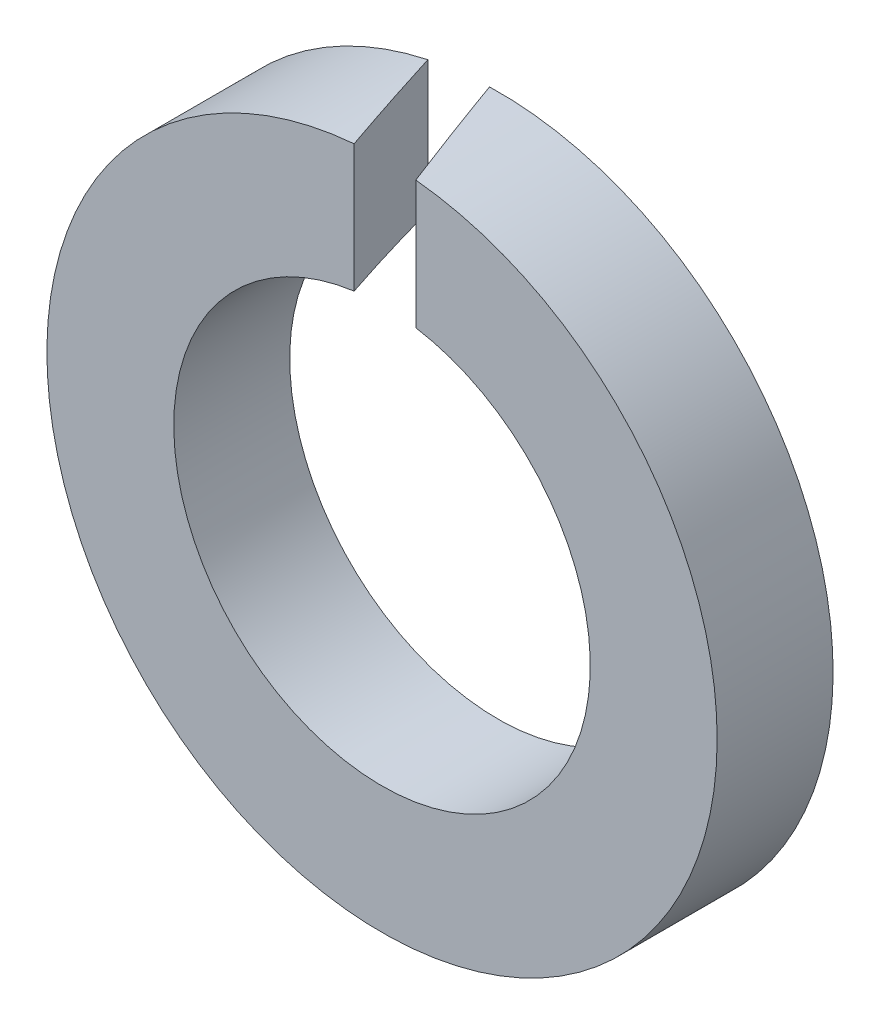
ISO-10303-21;
HEADER;
FILE_DESCRIPTION(('STEP AP214'),'2;1');
FILE_NAME('part.step','',(''),(''),'','','');
FILE_SCHEMA(('AUTOMOTIVE_DESIGN { 1 0 10303 214 1 1 1 1 }'));
ENDSEC;
DATA;
#1=APPLICATION_CONTEXT('core data for automotive mechanical design processes');
#2=APPLICATION_PROTOCOL_DEFINITION('international standard','automotive_design',2000,#1);
#3=PRODUCT_CONTEXT('',#1,'mechanical');
#4=PRODUCT('Part','Part','',(#3));
#5=PRODUCT_RELATED_PRODUCT_CATEGORY('part','',(#4));
#6=PRODUCT_DEFINITION_FORMATION('','',#4);
#7=PRODUCT_DEFINITION_CONTEXT('part definition',#1,'design');
#8=PRODUCT_DEFINITION('design','',#6,#7);
#9=PRODUCT_DEFINITION_SHAPE('','',#8);
#10=(LENGTH_UNIT() NAMED_UNIT(*) SI_UNIT(.MILLI.,.METRE.));
#11=(NAMED_UNIT(*) PLANE_ANGLE_UNIT() SI_UNIT($,.RADIAN.));
#12=(NAMED_UNIT(*) SI_UNIT($,.STERADIAN.) SOLID_ANGLE_UNIT());
#13=UNCERTAINTY_MEASURE_WITH_UNIT(LENGTH_MEASURE(1.E-05),#10,'distance_accuracy_value','');
#14=(GEOMETRIC_REPRESENTATION_CONTEXT(3) GLOBAL_UNCERTAINTY_ASSIGNED_CONTEXT((#13)) GLOBAL_UNIT_ASSIGNED_CONTEXT((#10,
#11,#12)) REPRESENTATION_CONTEXT('',''));
#15=CARTESIAN_POINT('',(0.,0.,0.));
#16=DIRECTION('',(0.,0.,1.));
#17=DIRECTION('',(1.,0.,0.));
#18=AXIS2_PLACEMENT_3D('',#15,#16,#17);
#19=CARTESIAN_POINT('',(0.,0.,-5.3));
#20=DIRECTION('',(0.,0.,1.));
#21=DIRECTION('',(1.,0.,0.));
#22=AXIS2_PLACEMENT_3D('',#19,#20,#21);
#23=CYLINDRICAL_SURFACE('',#22,15.32);
#24=CARTESIAN_POINT('',(0.,0.,-5.3));
#25=DIRECTION('',(0.,0.,1.));
#26=DIRECTION('',(1.,0.,0.));
#27=AXIS2_PLACEMENT_3D('',#24,#25,#26);
#28=CIRCLE('',#27,15.32);
#29=CARTESIAN_POINT('',(-3.20605556858195,14.9807746025085,-5.3));
#30=VERTEX_POINT('',#29);
#31=CARTESIAN_POINT('',(-0.385984471520785,15.3151368256292,-5.3));
#32=VERTEX_POINT('',#31);
#33=EDGE_CURVE('E97',#30,#32,#28,.T.);
#34=ORIENTED_EDGE('',*,*,#33,.T.);
#35=CARTESIAN_POINT('',(0.,0.,-4.23951638023651));
#36=DIRECTION('',(-0.939692620785909,0.,0.342020143325666));
#37=DIRECTION('',(0.342020143325666,0.,0.93969262078591));
#38=AXIS2_PLACEMENT_3D('',#35,#36,#37);
#39=ELLIPSE('',#38,44.7926834104988,15.32);
#40=CARTESIAN_POINT('',(1.54305777009007,15.2420921371761,0.));
#41=VERTEX_POINT('',#40);
#42=EDGE_CURVE('E84',#32,#41,#39,.F.);
#43=ORIENTED_EDGE('',*,*,#42,.T.);
#44=CARTESIAN_POINT('',(0.,0.,0.));
#45=DIRECTION('',(0.,0.,1.));
#46=DIRECTION('',(1.,0.,0.));
#47=AXIS2_PLACEMENT_3D('',#44,#45,#46);
#48=CIRCLE('',#47,15.32);
#49=CARTESIAN_POINT('',(-1.27701332697109,15.2666838888718,0.));
#50=VERTEX_POINT('',#49);
#51=EDGE_CURVE('E92',#50,#41,#48,.T.);
#52=ORIENTED_EDGE('',*,*,#51,.F.);
#53=CARTESIAN_POINT('',(0.,0.,3.50856528019573));
#54=DIRECTION('',(0.939692620785909,0.,-0.342020143325666));
#55=DIRECTION('',(0.342020143325666,0.,0.939692620785909));
#56=AXIS2_PLACEMENT_3D('',#53,#54,#55);
#57=ELLIPSE('',#56,44.7926834104988,15.32);
#58=EDGE_CURVE('E76',#50,#30,#57,.F.);
#59=ORIENTED_EDGE('',*,*,#58,.T.);
#60=EDGE_LOOP('',(#34,#43,#52,#59));
#61=FACE_BOUND('',#60,.T.);
#62=ADVANCED_FACE('F39',(#61),#23,.T.);
#63=CARTESIAN_POINT('',(0.,0.,-5.3));
#64=DIRECTION('',(0.,0.,1.));
#65=DIRECTION('',(1.,0.,0.));
#66=AXIS2_PLACEMENT_3D('',#63,#64,#65);
#67=PLANE('',#66);
#68=DIRECTION('',(0.,-1.,0.));
#69=VECTOR('',#68,1.);
#70=CARTESIAN_POINT('',(-0.385984471520785,15.32,-5.3));
#71=LINE('',#70,#69);
#72=CARTESIAN_POINT('',(-0.385984471520785,9.51217199107253,-5.3));
#73=VERTEX_POINT('',#72);
#74=EDGE_CURVE('E60',#32,#73,#71,.T.);
#75=ORIENTED_EDGE('',*,*,#74,.F.);
#76=ORIENTED_EDGE('',*,*,#33,.F.);
#77=DIRECTION('',(0.,-1.,0.));
#78=VECTOR('',#77,1.);
#79=CARTESIAN_POINT('',(-3.20605556858195,15.32,-5.3));
#80=LINE('',#79,#78);
#81=CARTESIAN_POINT('',(-3.20605556858195,8.96390582788355,-5.3));
#82=VERTEX_POINT('',#81);
#83=EDGE_CURVE('E79',#30,#82,#80,.T.);
#84=ORIENTED_EDGE('',*,*,#83,.T.);
#85=CARTESIAN_POINT('',(0.,0.,-5.3));
#86=DIRECTION('',(0.,0.,1.));
#87=DIRECTION('',(1.,0.,0.));
#88=AXIS2_PLACEMENT_3D('',#85,#86,#87);
#89=CIRCLE('',#88,9.52);
#90=EDGE_CURVE('E98',#82,#73,#89,.T.);
#91=ORIENTED_EDGE('',*,*,#90,.T.);
#92=EDGE_LOOP('',(#75,#76,#84,#91));
#93=FACE_BOUND('',#92,.T.);
#94=ADVANCED_FACE('F107',(#93),#67,.F.);
#95=CARTESIAN_POINT('',(0.,0.,0.));
#96=DIRECTION('',(0.,0.,1.));
#97=DIRECTION('',(1.,0.,0.));
#98=AXIS2_PLACEMENT_3D('',#95,#96,#97);
#99=PLANE('',#98);
#100=ORIENTED_EDGE('',*,*,#51,.T.);
#101=DIRECTION('',(0.,-1.,0.));
#102=VECTOR('',#101,1.);
#103=CARTESIAN_POINT('',(1.54305777009007,15.32,0.));
#104=LINE('',#103,#102);
#105=CARTESIAN_POINT('',(1.54305777009007,9.39411372712535,0.));
#106=VERTEX_POINT('',#105);
#107=EDGE_CURVE('E85',#41,#106,#104,.T.);
#108=ORIENTED_EDGE('',*,*,#107,.T.);
#109=CARTESIAN_POINT('',(0.,0.,0.));
#110=DIRECTION('',(0.,0.,1.));
#111=DIRECTION('',(1.,0.,0.));
#112=AXIS2_PLACEMENT_3D('',#109,#110,#111);
#113=CIRCLE('',#112,9.52);
#114=CARTESIAN_POINT('',(-1.27701332697109,9.43396189110059,0.));
#115=VERTEX_POINT('',#114);
#116=EDGE_CURVE('E94',#115,#106,#113,.T.);
#117=ORIENTED_EDGE('',*,*,#116,.F.);
#118=DIRECTION('',(0.,-1.,0.));
#119=VECTOR('',#118,1.);
#120=CARTESIAN_POINT('',(-1.27701332697109,15.32,0.));
#121=LINE('',#120,#119);
#122=EDGE_CURVE('E53',#50,#115,#121,.T.);
#123=ORIENTED_EDGE('',*,*,#122,.F.);
#124=EDGE_LOOP('',(#100,#108,#117,#123));
#125=FACE_BOUND('',#124,.T.);
#126=ADVANCED_FACE('F90',(#125),#99,.T.);
#127=CARTESIAN_POINT('',(0.,0.,-5.3));
#128=DIRECTION('',(0.,0.,1.));
#129=DIRECTION('',(1.,0.,0.));
#130=AXIS2_PLACEMENT_3D('',#127,#128,#129);
#131=CYLINDRICAL_SURFACE('',#130,9.52);
#132=CARTESIAN_POINT('',(0.,0.,-4.23951638023651));
#133=DIRECTION('',(-0.939692620785909,0.,0.342020143325666));
#134=DIRECTION('',(0.342020143325666,0.,0.93969262078591));
#135=AXIS2_PLACEMENT_3D('',#132,#133,#134);
#136=ELLIPSE('',#135,27.8346178895528,9.52);
#137=EDGE_CURVE('E11',#73,#106,#136,.F.);
#138=ORIENTED_EDGE('',*,*,#137,.F.);
#139=ORIENTED_EDGE('',*,*,#90,.F.);
#140=CARTESIAN_POINT('',(0.,0.,3.50856528019573));
#141=DIRECTION('',(0.939692620785909,0.,-0.342020143325666));
#142=DIRECTION('',(0.342020143325666,0.,0.939692620785909));
#143=AXIS2_PLACEMENT_3D('',#140,#141,#142);
#144=ELLIPSE('',#143,27.8346178895528,9.52);
#145=EDGE_CURVE('E46',#115,#82,#144,.F.);
#146=ORIENTED_EDGE('',*,*,#145,.F.);
#147=ORIENTED_EDGE('',*,*,#116,.T.);
#148=EDGE_LOOP('',(#138,#139,#146,#147));
#149=FACE_BOUND('',#148,.T.);
#150=ADVANCED_FACE('F109',(#149),#131,.F.);
#151=CARTESIAN_POINT('',(-1.27701332697109,15.32,0.));
#152=DIRECTION('',(0.939692620785909,0.,-0.342020143325666));
#153=DIRECTION('',(-0.342020143325666,0.,-0.939692620785909));
#154=AXIS2_PLACEMENT_3D('',#151,#152,#153);
#155=PLANE('',#154);
#156=ORIENTED_EDGE('',*,*,#122,.T.);
#157=ORIENTED_EDGE('',*,*,#145,.T.);
#158=ORIENTED_EDGE('',*,*,#83,.F.);
#159=ORIENTED_EDGE('',*,*,#58,.F.);
#160=EDGE_LOOP('',(#156,#157,#158,#159));
#161=FACE_BOUND('',#160,.T.);
#162=ADVANCED_FACE('F77',(#161),#155,.T.);
#163=CARTESIAN_POINT('',(1.54305777009007,15.32,0.));
#164=DIRECTION('',(-0.939692620785909,0.,0.342020143325666));
#165=DIRECTION('',(0.342020143325666,0.,0.93969262078591));
#166=AXIS2_PLACEMENT_3D('',#163,#164,#165);
#167=PLANE('',#166);
#168=ORIENTED_EDGE('',*,*,#74,.T.);
#169=ORIENTED_EDGE('',*,*,#137,.T.);
#170=ORIENTED_EDGE('',*,*,#107,.F.);
#171=ORIENTED_EDGE('',*,*,#42,.F.);
#172=EDGE_LOOP('',(#168,#169,#170,#171));
#173=FACE_BOUND('',#172,.T.);
#174=ADVANCED_FACE('F110',(#173),#167,.T.);
#175=CLOSED_SHELL('',(#62,#94,#126,#150,#162,#174));
#176=MANIFOLD_SOLID_BREP('B2',#175);
#177=ADVANCED_BREP_SHAPE_REPRESENTATION('',(#18,#176),#14);
#178=SHAPE_DEFINITION_REPRESENTATION(#9,#177);
ENDSEC;
END-ISO-10303-21;
